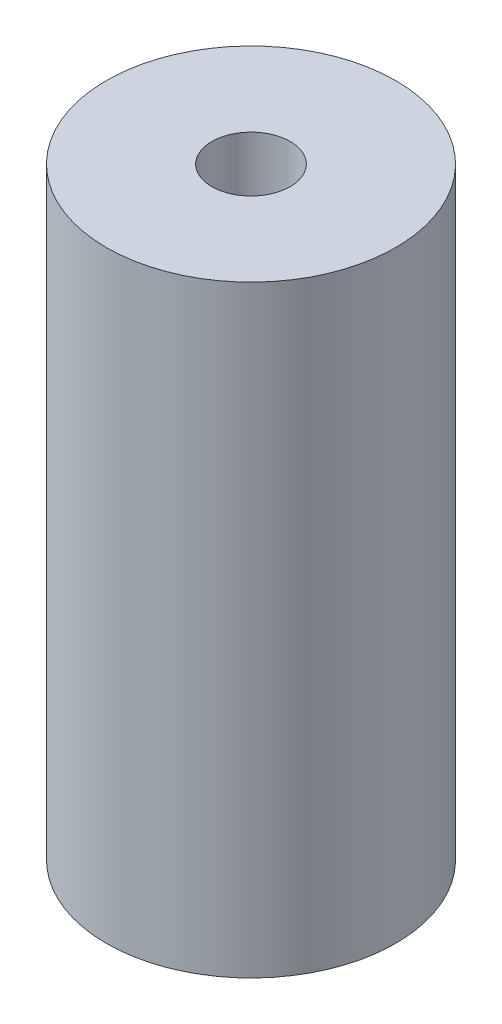
ISO-10303-21;
HEADER;
FILE_DESCRIPTION(('STEP AP214'),'2;1');
FILE_NAME('part.step','',(''),(''),'','','');
FILE_SCHEMA(('AUTOMOTIVE_DESIGN { 1 0 10303 214 1 1 1 1 }'));
ENDSEC;
DATA;
#1=APPLICATION_CONTEXT('core data for automotive mechanical design processes');
#2=APPLICATION_PROTOCOL_DEFINITION('international standard','automotive_design',2000,#1);
#3=PRODUCT_CONTEXT('',#1,'mechanical');
#4=PRODUCT('Part','Part','',(#3));
#5=PRODUCT_RELATED_PRODUCT_CATEGORY('part','',(#4));
#6=PRODUCT_DEFINITION_FORMATION('','',#4);
#7=PRODUCT_DEFINITION_CONTEXT('part definition',#1,'design');
#8=PRODUCT_DEFINITION('design','',#6,#7);
#9=PRODUCT_DEFINITION_SHAPE('','',#8);
#10=(LENGTH_UNIT() NAMED_UNIT(*) SI_UNIT(.MILLI.,.METRE.));
#11=(NAMED_UNIT(*) PLANE_ANGLE_UNIT() SI_UNIT($,.RADIAN.));
#12=(NAMED_UNIT(*) SI_UNIT($,.STERADIAN.) SOLID_ANGLE_UNIT());
#13=UNCERTAINTY_MEASURE_WITH_UNIT(LENGTH_MEASURE(1.E-05),#10,'distance_accuracy_value','');
#14=(GEOMETRIC_REPRESENTATION_CONTEXT(3) GLOBAL_UNCERTAINTY_ASSIGNED_CONTEXT((#13)) GLOBAL_UNIT_ASSIGNED_CONTEXT((#10,
#11,#12)) REPRESENTATION_CONTEXT('',''));
#15=CARTESIAN_POINT('',(0.,0.,0.));
#16=DIRECTION('',(0.,0.,1.));
#17=DIRECTION('',(1.,0.,0.));
#18=AXIS2_PLACEMENT_3D('',#15,#16,#17);
#19=CARTESIAN_POINT('',(0.,25.,0.));
#20=DIRECTION('',(0.,1.,0.));
#21=DIRECTION('',(0.,0.,1.));
#22=AXIS2_PLACEMENT_3D('',#19,#20,#21);
#23=PLANE('',#22);
#24=CARTESIAN_POINT('',(0.,25.,0.));
#25=DIRECTION('',(0.,1.,0.));
#26=DIRECTION('',(0.,0.,1.));
#27=AXIS2_PLACEMENT_3D('',#24,#25,#26);
#28=CIRCLE('',#27,12.);
#29=CARTESIAN_POINT('',(0.,25.,12.));
#30=VERTEX_POINT('',#29);
#31=EDGE_CURVE('E10',#30,#30,#28,.T.);
#32=ORIENTED_EDGE('',*,*,#31,.T.);
#33=EDGE_LOOP('',(#32));
#34=FACE_BOUND('',#33,.T.);
#35=CARTESIAN_POINT('',(0.,25.,0.));
#36=DIRECTION('',(0.,1.,0.));
#37=DIRECTION('',(0.,0.,1.));
#38=AXIS2_PLACEMENT_3D('',#35,#36,#37);
#39=CIRCLE('',#38,3.25);
#40=CARTESIAN_POINT('',(0.,25.,3.25));
#41=VERTEX_POINT('',#40);
#42=EDGE_CURVE('E40',#41,#41,#39,.T.);
#43=ORIENTED_EDGE('',*,*,#42,.F.);
#44=EDGE_LOOP('',(#43));
#45=FACE_BOUND('',#44,.T.);
#46=ADVANCED_FACE('F29',(#34,#45),#23,.T.);
#47=CARTESIAN_POINT('',(0.,-25.,0.));
#48=DIRECTION('',(0.,1.,0.));
#49=DIRECTION('',(0.,0.,1.));
#50=AXIS2_PLACEMENT_3D('',#47,#48,#49);
#51=PLANE('',#50);
#52=CARTESIAN_POINT('',(0.,-25.,0.));
#53=DIRECTION('',(0.,1.,0.));
#54=DIRECTION('',(0.,0.,1.));
#55=AXIS2_PLACEMENT_3D('',#52,#53,#54);
#56=CIRCLE('',#55,12.);
#57=CARTESIAN_POINT('',(0.,-25.,12.));
#58=VERTEX_POINT('',#57);
#59=EDGE_CURVE('E33',#58,#58,#56,.T.);
#60=ORIENTED_EDGE('',*,*,#59,.F.);
#61=EDGE_LOOP('',(#60));
#62=FACE_BOUND('',#61,.T.);
#63=CARTESIAN_POINT('',(0.,-25.,0.));
#64=DIRECTION('',(0.,1.,0.));
#65=DIRECTION('',(0.,0.,1.));
#66=AXIS2_PLACEMENT_3D('',#63,#64,#65);
#67=CIRCLE('',#66,3.25);
#68=CARTESIAN_POINT('',(0.,-25.,3.25));
#69=VERTEX_POINT('',#68);
#70=EDGE_CURVE('E42',#69,#69,#67,.T.);
#71=ORIENTED_EDGE('',*,*,#70,.T.);
#72=EDGE_LOOP('',(#71));
#73=FACE_BOUND('',#72,.T.);
#74=ADVANCED_FACE('F52',(#62,#73),#51,.F.);
#75=CARTESIAN_POINT('',(0.,25.,0.));
#76=DIRECTION('',(0.,-1.,0.));
#77=DIRECTION('',(0.,0.,-1.));
#78=AXIS2_PLACEMENT_3D('',#75,#76,#77);
#79=CYLINDRICAL_SURFACE('',#78,12.);
#80=ORIENTED_EDGE('',*,*,#31,.F.);
#81=EDGE_LOOP('',(#80));
#82=FACE_BOUND('',#81,.T.);
#83=ORIENTED_EDGE('',*,*,#59,.T.);
#84=EDGE_LOOP('',(#83));
#85=FACE_BOUND('',#84,.T.);
#86=ADVANCED_FACE('F31',(#82,#85),#79,.T.);
#87=CARTESIAN_POINT('',(0.,25.,0.));
#88=DIRECTION('',(0.,-1.,0.));
#89=DIRECTION('',(0.,0.,-1.));
#90=AXIS2_PLACEMENT_3D('',#87,#88,#89);
#91=CYLINDRICAL_SURFACE('',#90,3.25);
#92=ORIENTED_EDGE('',*,*,#42,.T.);
#93=EDGE_LOOP('',(#92));
#94=FACE_BOUND('',#93,.T.);
#95=ORIENTED_EDGE('',*,*,#70,.F.);
#96=EDGE_LOOP('',(#95));
#97=FACE_BOUND('',#96,.T.);
#98=ADVANCED_FACE('F48',(#94,#97),#91,.F.);
#99=CLOSED_SHELL('',(#46,#74,#86,#98));
#100=MANIFOLD_SOLID_BREP('B2',#99);
#101=ADVANCED_BREP_SHAPE_REPRESENTATION('',(#18,#100),#14);
#102=SHAPE_DEFINITION_REPRESENTATION(#9,#101);
ENDSEC;
END-ISO-10303-21;
